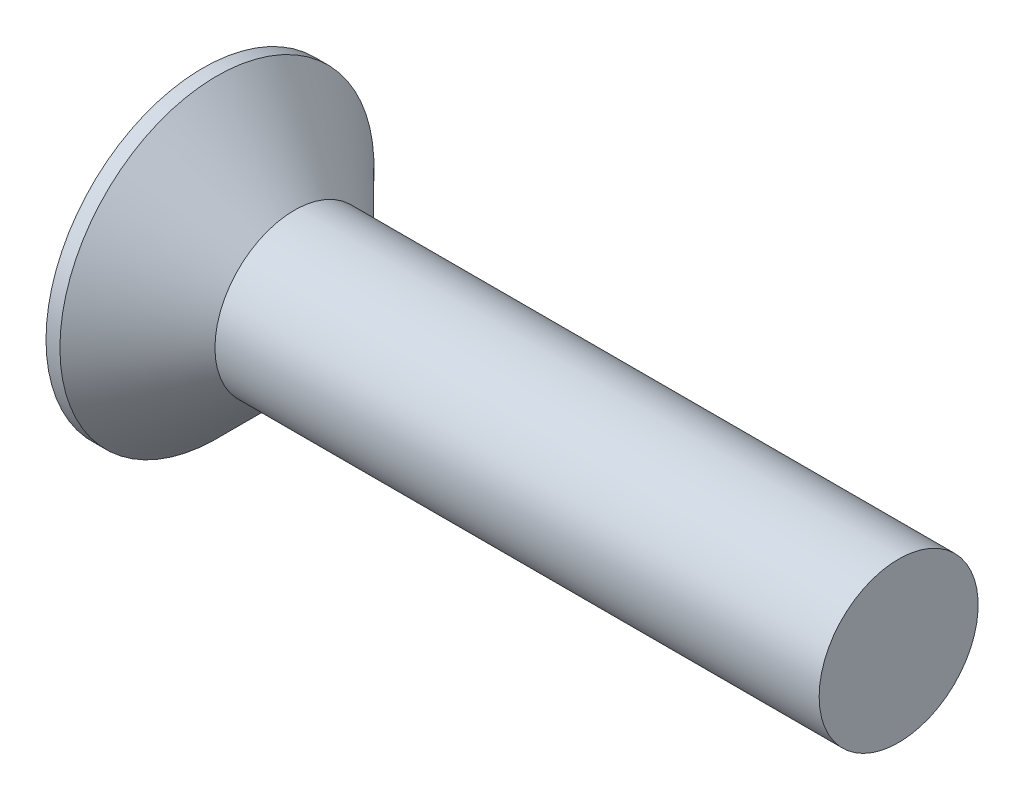
ISO-10303-21;
HEADER;
FILE_DESCRIPTION(('STEP AP214'),'2;1');
FILE_NAME('part.step','',(''),(''),'','','');
FILE_SCHEMA(('AUTOMOTIVE_DESIGN { 1 0 10303 214 1 1 1 1 }'));
ENDSEC;
DATA;
#1=APPLICATION_CONTEXT('core data for automotive mechanical design processes');
#2=APPLICATION_PROTOCOL_DEFINITION('international standard','automotive_design',2000,#1);
#3=PRODUCT_CONTEXT('',#1,'mechanical');
#4=PRODUCT('Part','Part','',(#3));
#5=PRODUCT_RELATED_PRODUCT_CATEGORY('part','',(#4));
#6=PRODUCT_DEFINITION_FORMATION('','',#4);
#7=PRODUCT_DEFINITION_CONTEXT('part definition',#1,'design');
#8=PRODUCT_DEFINITION('design','',#6,#7);
#9=PRODUCT_DEFINITION_SHAPE('','',#8);
#10=(LENGTH_UNIT() NAMED_UNIT(*) SI_UNIT(.MILLI.,.METRE.));
#11=(NAMED_UNIT(*) PLANE_ANGLE_UNIT() SI_UNIT($,.RADIAN.));
#12=(NAMED_UNIT(*) SI_UNIT($,.STERADIAN.) SOLID_ANGLE_UNIT());
#13=UNCERTAINTY_MEASURE_WITH_UNIT(LENGTH_MEASURE(1.E-05),#10,'distance_accuracy_value','');
#14=(GEOMETRIC_REPRESENTATION_CONTEXT(3) GLOBAL_UNCERTAINTY_ASSIGNED_CONTEXT((#13)) GLOBAL_UNIT_ASSIGNED_CONTEXT((#10,
#11,#12)) REPRESENTATION_CONTEXT('',''));
#15=CARTESIAN_POINT('',(0.,0.,0.));
#16=DIRECTION('',(0.,0.,1.));
#17=DIRECTION('',(1.,0.,0.));
#18=AXIS2_PLACEMENT_3D('',#15,#16,#17);
#19=CARTESIAN_POINT('',(0.,0.,0.));
#20=DIRECTION('',(-1.,0.,0.));
#21=DIRECTION('',(0.,0.,1.));
#22=AXIS2_PLACEMENT_3D('',#19,#20,#21);
#23=PLANE('',#22);
#24=CARTESIAN_POINT('',(0.,0.,0.));
#25=DIRECTION('',(-1.,0.,0.));
#26=DIRECTION('',(0.,0.,1.));
#27=AXIS2_PLACEMENT_3D('',#24,#25,#26);
#28=CIRCLE('',#27,7.9);
#29=CARTESIAN_POINT('',(0.,0.,7.9));
#30=VERTEX_POINT('',#29);
#31=EDGE_CURVE('E46',#30,#30,#28,.T.);
#32=ORIENTED_EDGE('',*,*,#31,.T.);
#33=EDGE_LOOP('',(#32));
#34=FACE_BOUND('',#33,.T.);
#35=DIRECTION('',(0.,1.,0.));
#36=VECTOR('',#35,1.);
#37=CARTESIAN_POINT('',(0.,-4.39,-0.9));
#38=LINE('',#37,#36);
#39=CARTESIAN_POINT('',(0.,-4.39,-0.9));
#40=VERTEX_POINT('',#39);
#41=CARTESIAN_POINT('',(0.,-0.899999999999997,-0.899999999999999));
#42=VERTEX_POINT('',#41);
#43=EDGE_CURVE('E107',#40,#42,#38,.T.);
#44=ORIENTED_EDGE('',*,*,#43,.T.);
#45=DIRECTION('',(0.,0.,-1.));
#46=VECTOR('',#45,1.);
#47=CARTESIAN_POINT('',(0.,-0.900000000000015,4.39));
#48=LINE('',#47,#46);
#49=CARTESIAN_POINT('',(0.,-0.899999999999985,-4.39));
#50=VERTEX_POINT('',#49);
#51=EDGE_CURVE('E87',#42,#50,#48,.T.);
#52=ORIENTED_EDGE('',*,*,#51,.T.);
#53=DIRECTION('',(0.,1.,0.));
#54=VECTOR('',#53,1.);
#55=CARTESIAN_POINT('',(0.,-0.899999999999985,-4.39));
#56=LINE('',#55,#54);
#57=CARTESIAN_POINT('',(0.,0.900000000000015,-4.39));
#58=VERTEX_POINT('',#57);
#59=EDGE_CURVE('E344',#50,#58,#56,.T.);
#60=ORIENTED_EDGE('',*,*,#59,.T.);
#61=DIRECTION('',(0.,0.,1.));
#62=VECTOR('',#61,1.);
#63=CARTESIAN_POINT('',(0.,0.900000000000015,-4.39));
#64=LINE('',#63,#62);
#65=CARTESIAN_POINT('',(0.,0.900000000000002,-0.899999999999999));
#66=VERTEX_POINT('',#65);
#67=EDGE_CURVE('E103',#58,#66,#64,.T.);
#68=ORIENTED_EDGE('',*,*,#67,.T.);
#69=CARTESIAN_POINT('',(0.,4.39,-0.899999999999999));
#70=VERTEX_POINT('',#69);
#71=EDGE_CURVE('E97',#66,#70,#38,.T.);
#72=ORIENTED_EDGE('',*,*,#71,.T.);
#73=DIRECTION('',(0.,0.,1.));
#74=VECTOR('',#73,1.);
#75=CARTESIAN_POINT('',(0.,4.39,-0.899999999999999));
#76=LINE('',#75,#74);
#77=CARTESIAN_POINT('',(0.,4.39,0.899999999999999));
#78=VERTEX_POINT('',#77);
#79=EDGE_CURVE('E100',#70,#78,#76,.T.);
#80=ORIENTED_EDGE('',*,*,#79,.T.);
#81=DIRECTION('',(0.,-1.,0.));
#82=VECTOR('',#81,1.);
#83=CARTESIAN_POINT('',(0.,4.39,0.899999999999999));
#84=LINE('',#83,#82);
#85=CARTESIAN_POINT('',(0.,0.899999999999996,0.899999999999999));
#86=VERTEX_POINT('',#85);
#87=EDGE_CURVE('E356',#78,#86,#84,.T.);
#88=ORIENTED_EDGE('',*,*,#87,.T.);
#89=CARTESIAN_POINT('',(0.,0.899999999999984,4.39));
#90=VERTEX_POINT('',#89);
#91=EDGE_CURVE('E339',#86,#90,#64,.T.);
#92=ORIENTED_EDGE('',*,*,#91,.T.);
#93=DIRECTION('',(0.,-1.,0.));
#94=VECTOR('',#93,1.);
#95=CARTESIAN_POINT('',(0.,0.899999999999984,4.39));
#96=LINE('',#95,#94);
#97=CARTESIAN_POINT('',(0.,-0.900000000000015,4.39));
#98=VERTEX_POINT('',#97);
#99=EDGE_CURVE('E325',#90,#98,#96,.T.);
#100=ORIENTED_EDGE('',*,*,#99,.T.);
#101=CARTESIAN_POINT('',(0.,-0.900000000000003,0.899999999999999));
#102=VERTEX_POINT('',#101);
#103=EDGE_CURVE('E337',#98,#102,#48,.T.);
#104=ORIENTED_EDGE('',*,*,#103,.T.);
#105=CARTESIAN_POINT('',(0.,-4.39,0.9));
#106=VERTEX_POINT('',#105);
#107=EDGE_CURVE('E113',#102,#106,#84,.T.);
#108=ORIENTED_EDGE('',*,*,#107,.T.);
#109=DIRECTION('',(0.,0.,-1.));
#110=VECTOR('',#109,1.);
#111=CARTESIAN_POINT('',(0.,-4.39,0.9));
#112=LINE('',#111,#110);
#113=EDGE_CURVE('E136',#106,#40,#112,.T.);
#114=ORIENTED_EDGE('',*,*,#113,.T.);
#115=EDGE_LOOP('',(#44,#52,#60,#68,#72,#80,#88,#92,#100,#104,#108,#114));
#116=FACE_BOUND('',#115,.T.);
#117=ADVANCED_FACE('F39',(#34,#116),#23,.T.);
#118=CARTESIAN_POINT('',(5.43736040609137,0.,0.398604060913706));
#119=DIRECTION('',(-0.0918235415051405,0.,-0.995775294544635));
#120=DIRECTION('',(-0.995775294544635,0.,0.0918235415051405));
#121=AXIS2_PLACEMENT_3D('',#118,#119,#120);
#122=PLANE('',#121);
#123=ORIENTED_EDGE('',*,*,#107,.F.);
#124=DIRECTION('',(0.991603685025061,0.091438864397803,-0.0914388643978027));
#125=VECTOR('',#124,1.);
#126=CARTESIAN_POINT('',(5.47350228069464,-0.395271306083487,0.395271306083486));
#127=LINE('',#126,#125);
#128=CARTESIAN_POINT('',(4.88,-0.450000000000002,0.449999999999998));
#129=VERTEX_POINT('',#128);
#130=EDGE_CURVE('E131',#102,#129,#127,.T.);
#131=ORIENTED_EDGE('',*,*,#130,.T.);
#132=DIRECTION('',(0.776066154586016,0.626578001858382,-0.0715634773696122));
#133=VECTOR('',#132,1.);
#134=CARTESIAN_POINT('',(0.,-4.39,0.9));
#135=LINE('',#134,#133);
#136=EDGE_CURVE('E108',#106,#129,#135,.T.);
#137=ORIENTED_EDGE('',*,*,#136,.F.);
#138=EDGE_LOOP('',(#123,#131,#137));
#139=FACE_BOUND('',#138,.T.);
#140=ADVANCED_FACE('F159',(#139),#122,.T.);
#141=DIRECTION('',(0.776066154586016,-0.626578001858382,-0.0715634773696121));
#142=VECTOR('',#141,1.);
#143=CARTESIAN_POINT('',(0.,4.39,0.899999999999999));
#144=LINE('',#143,#142);
#145=CARTESIAN_POINT('',(4.88,0.45,0.45));
#146=VERTEX_POINT('',#145);
#147=EDGE_CURVE('E53',#78,#146,#144,.T.);
#148=ORIENTED_EDGE('',*,*,#147,.T.);
#149=DIRECTION('',(-0.991603685025061,0.0914388643978024,0.0914388643978027));
#150=VECTOR('',#149,1.);
#151=CARTESIAN_POINT('',(5.47350228069464,0.395271306083484,0.395271306083486));
#152=LINE('',#151,#150);
#153=EDGE_CURVE('E352',#146,#86,#152,.T.);
#154=ORIENTED_EDGE('',*,*,#153,.T.);
#155=ORIENTED_EDGE('',*,*,#87,.F.);
#156=EDGE_LOOP('',(#148,#154,#155));
#157=FACE_BOUND('',#156,.T.);
#158=ADVANCED_FACE('F163',(#157),#122,.T.);
#159=CARTESIAN_POINT('',(5.43736040609137,0.,-0.398604060913706));
#160=DIRECTION('',(-0.0918235415051404,0.,0.995775294544635));
#161=DIRECTION('',(0.995775294544635,0.,0.0918235415051404));
#162=AXIS2_PLACEMENT_3D('',#159,#160,#161);
#163=PLANE('',#162);
#164=DIRECTION('',(0.776066154586016,0.626578001858382,0.0715634773696121));
#165=VECTOR('',#164,1.);
#166=CARTESIAN_POINT('',(0.,-4.39,-0.9));
#167=LINE('',#166,#165);
#168=CARTESIAN_POINT('',(4.88,-0.449999999999999,-0.450000000000002));
#169=VERTEX_POINT('',#168);
#170=EDGE_CURVE('E62',#40,#169,#167,.T.);
#171=ORIENTED_EDGE('',*,*,#170,.T.);
#172=DIRECTION('',(-0.991603685025061,-0.0914388643978024,-0.0914388643978027));
#173=VECTOR('',#172,1.);
#174=CARTESIAN_POINT('',(5.47350228069464,-0.395271306083484,-0.395271306083486));
#175=LINE('',#174,#173);
#176=EDGE_CURVE('E11',#169,#42,#175,.T.);
#177=ORIENTED_EDGE('',*,*,#176,.T.);
#178=ORIENTED_EDGE('',*,*,#43,.F.);
#179=EDGE_LOOP('',(#171,#177,#178));
#180=FACE_BOUND('',#179,.T.);
#181=ADVANCED_FACE('F156',(#180),#163,.T.);
#182=ORIENTED_EDGE('',*,*,#71,.F.);
#183=DIRECTION('',(0.991603685025061,-0.091438864397803,0.0914388643978027));
#184=VECTOR('',#183,1.);
#185=CARTESIAN_POINT('',(5.47350228069464,0.395271306083487,-0.395271306083486));
#186=LINE('',#185,#184);
#187=CARTESIAN_POINT('',(4.88,0.45,-0.45));
#188=VERTEX_POINT('',#187);
#189=EDGE_CURVE('E116',#66,#188,#186,.T.);
#190=ORIENTED_EDGE('',*,*,#189,.T.);
#191=DIRECTION('',(0.776066154586016,-0.626578001858382,0.0715634773696121));
#192=VECTOR('',#191,1.);
#193=CARTESIAN_POINT('',(0.,4.39,-0.899999999999999));
#194=LINE('',#193,#192);
#195=EDGE_CURVE('E112',#70,#188,#194,.T.);
#196=ORIENTED_EDGE('',*,*,#195,.F.);
#197=EDGE_LOOP('',(#182,#190,#196));
#198=FACE_BOUND('',#197,.T.);
#199=ADVANCED_FACE('F115',(#198),#163,.T.);
#200=CARTESIAN_POINT('',(-6.34999999999999,0.,0.));
#201=DIRECTION('',(-1.,0.,0.));
#202=DIRECTION('',(0.,0.,1.));
#203=AXIS2_PLACEMENT_3D('',#200,#201,#202);
#204=CYLINDRICAL_SURFACE('',#203,7.9);
#205=CARTESIAN_POINT('',(0.700000000000013,0.,0.));
#206=DIRECTION('',(-1.,0.,0.));
#207=DIRECTION('',(0.,0.,1.));
#208=AXIS2_PLACEMENT_3D('',#205,#206,#207);
#209=CIRCLE('',#208,7.9);
#210=CARTESIAN_POINT('',(0.700000000000013,0.,7.9));
#211=VERTEX_POINT('',#210);
#212=EDGE_CURVE('E139',#211,#211,#209,.T.);
#213=ORIENTED_EDGE('',*,*,#212,.T.);
#214=EDGE_LOOP('',(#213));
#215=FACE_BOUND('',#214,.T.);
#216=ORIENTED_EDGE('',*,*,#31,.F.);
#217=EDGE_LOOP('',(#216));
#218=FACE_BOUND('',#217,.T.);
#219=ADVANCED_FACE('F145',(#215,#218),#204,.T.);
#220=CARTESIAN_POINT('',(0.700000000000013,0.,0.));
#221=DIRECTION('',(-1.,0.,0.));
#222=DIRECTION('',(0.,0.,1.));
#223=AXIS2_PLACEMENT_3D('',#220,#221,#222);
#224=CONICAL_SURFACE('',#223,7.9,0.78539816339745);
#225=CARTESIAN_POINT('',(4.6,0.,0.));
#226=DIRECTION('',(-1.,0.,0.));
#227=DIRECTION('',(0.,0.,1.));
#228=AXIS2_PLACEMENT_3D('',#225,#226,#227);
#229=CIRCLE('',#228,4.);
#230=CARTESIAN_POINT('',(4.6,0.,4.));
#231=VERTEX_POINT('',#230);
#232=EDGE_CURVE('E135',#231,#231,#229,.T.);
#233=ORIENTED_EDGE('',*,*,#232,.T.);
#234=EDGE_LOOP('',(#233));
#235=FACE_BOUND('',#234,.T.);
#236=ORIENTED_EDGE('',*,*,#212,.F.);
#237=EDGE_LOOP('',(#236));
#238=FACE_BOUND('',#237,.T.);
#239=ADVANCED_FACE('F147',(#235,#238),#224,.T.);
#240=CARTESIAN_POINT('',(-6.34999999999999,0.,0.));
#241=DIRECTION('',(-1.,0.,0.));
#242=DIRECTION('',(0.,0.,1.));
#243=AXIS2_PLACEMENT_3D('',#240,#241,#242);
#244=CYLINDRICAL_SURFACE('',#243,4.);
#245=CARTESIAN_POINT('',(35.,0.,0.));
#246=DIRECTION('',(-1.,0.,0.));
#247=DIRECTION('',(0.,0.,1.));
#248=AXIS2_PLACEMENT_3D('',#245,#246,#247);
#249=CIRCLE('',#248,4.);
#250=CARTESIAN_POINT('',(35.,0.,4.));
#251=VERTEX_POINT('',#250);
#252=EDGE_CURVE('E132',#251,#251,#249,.T.);
#253=ORIENTED_EDGE('',*,*,#252,.T.);
#254=EDGE_LOOP('',(#253));
#255=FACE_BOUND('',#254,.T.);
#256=ORIENTED_EDGE('',*,*,#232,.F.);
#257=EDGE_LOOP('',(#256));
#258=FACE_BOUND('',#257,.T.);
#259=ADVANCED_FACE('F153',(#255,#258),#244,.T.);
#260=CARTESIAN_POINT('',(35.,4.,0.));
#261=DIRECTION('',(1.,0.,0.));
#262=DIRECTION('',(0.,0.,-1.));
#263=AXIS2_PLACEMENT_3D('',#260,#261,#262);
#264=PLANE('',#263);
#265=ORIENTED_EDGE('',*,*,#252,.F.);
#266=EDGE_LOOP('',(#265));
#267=FACE_BOUND('',#266,.T.);
#268=ADVANCED_FACE('F183',(#267),#264,.T.);
#269=CARTESIAN_POINT('',(4.88,0.45,-0.45));
#270=DIRECTION('',(1.,0.,0.));
#271=DIRECTION('',(0.,0.,-1.));
#272=AXIS2_PLACEMENT_3D('',#269,#270,#271);
#273=PLANE('',#272);
#274=DIRECTION('',(0.,1.,0.));
#275=VECTOR('',#274,1.);
#276=CARTESIAN_POINT('',(4.88,-0.45,-0.45));
#277=LINE('',#276,#275);
#278=EDGE_CURVE('E127',#169,#188,#277,.T.);
#279=ORIENTED_EDGE('',*,*,#278,.F.);
#280=DIRECTION('',(0.,0.,-1.));
#281=VECTOR('',#280,1.);
#282=CARTESIAN_POINT('',(4.88,-0.45,0.45));
#283=LINE('',#282,#281);
#284=EDGE_CURVE('E118',#129,#169,#283,.T.);
#285=ORIENTED_EDGE('',*,*,#284,.F.);
#286=DIRECTION('',(0.,-1.,0.));
#287=VECTOR('',#286,1.);
#288=CARTESIAN_POINT('',(4.88,0.45,0.45));
#289=LINE('',#288,#287);
#290=EDGE_CURVE('E121',#146,#129,#289,.T.);
#291=ORIENTED_EDGE('',*,*,#290,.F.);
#292=DIRECTION('',(0.,0.,1.));
#293=VECTOR('',#292,1.);
#294=CARTESIAN_POINT('',(4.88,0.45,-0.45));
#295=LINE('',#294,#293);
#296=EDGE_CURVE('E125',#188,#146,#295,.T.);
#297=ORIENTED_EDGE('',*,*,#296,.F.);
#298=EDGE_LOOP('',(#279,#285,#291,#297));
#299=FACE_BOUND('',#298,.T.);
#300=ADVANCED_FACE('F180',(#299),#273,.F.);
#301=CARTESIAN_POINT('',(0.,-4.39,-0.9));
#302=DIRECTION('',(-0.628188647758139,0.778061066258812,0.));
#303=DIRECTION('',(-0.778061066258813,-0.62818864775814,0.));
#304=AXIS2_PLACEMENT_3D('',#301,#302,#303);
#305=PLANE('',#304);
#306=ORIENTED_EDGE('',*,*,#170,.F.);
#307=ORIENTED_EDGE('',*,*,#113,.F.);
#308=ORIENTED_EDGE('',*,*,#136,.T.);
#309=ORIENTED_EDGE('',*,*,#284,.T.);
#310=EDGE_LOOP('',(#306,#307,#308,#309));
#311=FACE_BOUND('',#310,.T.);
#312=ADVANCED_FACE('F172',(#311),#305,.T.);
#313=CARTESIAN_POINT('',(0.,4.39,0.899999999999999));
#314=DIRECTION('',(-0.628188647758139,-0.778061066258812,0.));
#315=DIRECTION('',(0.778061066258813,-0.62818864775814,0.));
#316=AXIS2_PLACEMENT_3D('',#313,#314,#315);
#317=PLANE('',#316);
#318=ORIENTED_EDGE('',*,*,#147,.F.);
#319=ORIENTED_EDGE('',*,*,#79,.F.);
#320=ORIENTED_EDGE('',*,*,#195,.T.);
#321=ORIENTED_EDGE('',*,*,#296,.T.);
#322=EDGE_LOOP('',(#318,#319,#320,#321));
#323=FACE_BOUND('',#322,.T.);
#324=ADVANCED_FACE('F111',(#323),#317,.T.);
#325=CARTESIAN_POINT('',(5.43736040609137,-0.398604060913706,0.));
#326=DIRECTION('',(-0.0918235415051405,0.995775294544635,0.));
#327=DIRECTION('',(-0.995775294544635,-0.0918235415051405,0.));
#328=AXIS2_PLACEMENT_3D('',#325,#326,#327);
#329=PLANE('',#328);
#330=DIRECTION('',(0.776066154586016,0.07156347736961,0.626578001858382));
#331=VECTOR('',#330,1.);
#332=CARTESIAN_POINT('',(0.,-0.899999999999985,-4.39));
#333=LINE('',#332,#331);
#334=EDGE_CURVE('E346',#50,#169,#333,.T.);
#335=ORIENTED_EDGE('',*,*,#334,.F.);
#336=ORIENTED_EDGE('',*,*,#51,.F.);
#337=ORIENTED_EDGE('',*,*,#176,.F.);
#338=EDGE_LOOP('',(#335,#336,#337));
#339=FACE_BOUND('',#338,.T.);
#340=ADVANCED_FACE('F179',(#339),#329,.T.);
#341=CARTESIAN_POINT('',(5.43736040609137,0.398604060913706,0.));
#342=DIRECTION('',(-0.0918235415051404,-0.995775294544635,0.));
#343=DIRECTION('',(0.995775294544635,-0.0918235415051404,0.));
#344=AXIS2_PLACEMENT_3D('',#341,#342,#343);
#345=PLANE('',#344);
#346=ORIENTED_EDGE('',*,*,#67,.F.);
#347=DIRECTION('',(0.776066154586016,-0.0715634773696143,0.626578001858382));
#348=VECTOR('',#347,1.);
#349=CARTESIAN_POINT('',(0.,0.900000000000015,-4.39));
#350=LINE('',#349,#348);
#351=EDGE_CURVE('E78',#58,#188,#350,.T.);
#352=ORIENTED_EDGE('',*,*,#351,.T.);
#353=ORIENTED_EDGE('',*,*,#189,.F.);
#354=EDGE_LOOP('',(#346,#352,#353));
#355=FACE_BOUND('',#354,.T.);
#356=ADVANCED_FACE('F223',(#355),#345,.T.);
#357=CARTESIAN_POINT('',(0.,0.900000000000015,-4.39));
#358=DIRECTION('',(-0.628188647758139,0.,0.778061066258812));
#359=DIRECTION('',(-0.778061066258813,0.,-0.62818864775814));
#360=AXIS2_PLACEMENT_3D('',#357,#358,#359);
#361=PLANE('',#360);
#362=ORIENTED_EDGE('',*,*,#351,.F.);
#363=ORIENTED_EDGE('',*,*,#59,.F.);
#364=ORIENTED_EDGE('',*,*,#334,.T.);
#365=ORIENTED_EDGE('',*,*,#278,.T.);
#366=EDGE_LOOP('',(#362,#363,#364,#365));
#367=FACE_BOUND('',#366,.T.);
#368=ADVANCED_FACE('F231',(#367),#361,.T.);
#369=ORIENTED_EDGE('',*,*,#103,.F.);
#370=DIRECTION('',(0.776066154586016,0.0715634773696143,-0.626578001858382));
#371=VECTOR('',#370,1.);
#372=CARTESIAN_POINT('',(0.,-0.900000000000015,4.39));
#373=LINE('',#372,#371);
#374=EDGE_CURVE('E322',#98,#129,#373,.T.);
#375=ORIENTED_EDGE('',*,*,#374,.T.);
#376=ORIENTED_EDGE('',*,*,#130,.F.);
#377=EDGE_LOOP('',(#369,#375,#376));
#378=FACE_BOUND('',#377,.T.);
#379=ADVANCED_FACE('F225',(#378),#329,.T.);
#380=DIRECTION('',(0.776066154586016,-0.0715634773696099,-0.626578001858382));
#381=VECTOR('',#380,1.);
#382=CARTESIAN_POINT('',(0.,0.899999999999984,4.39));
#383=LINE('',#382,#381);
#384=EDGE_CURVE('E333',#90,#146,#383,.T.);
#385=ORIENTED_EDGE('',*,*,#384,.F.);
#386=ORIENTED_EDGE('',*,*,#91,.F.);
#387=ORIENTED_EDGE('',*,*,#153,.F.);
#388=EDGE_LOOP('',(#385,#386,#387));
#389=FACE_BOUND('',#388,.T.);
#390=ADVANCED_FACE('F233',(#389),#345,.T.);
#391=CARTESIAN_POINT('',(0.,-0.900000000000014,4.39));
#392=DIRECTION('',(-0.628188647758139,0.,-0.778061066258812));
#393=DIRECTION('',(0.778061066258813,0.,-0.62818864775814));
#394=AXIS2_PLACEMENT_3D('',#391,#392,#393);
#395=PLANE('',#394);
#396=ORIENTED_EDGE('',*,*,#374,.F.);
#397=ORIENTED_EDGE('',*,*,#99,.F.);
#398=ORIENTED_EDGE('',*,*,#384,.T.);
#399=ORIENTED_EDGE('',*,*,#290,.T.);
#400=EDGE_LOOP('',(#396,#397,#398,#399));
#401=FACE_BOUND('',#400,.T.);
#402=ADVANCED_FACE('F252',(#401),#395,.T.);
#403=CLOSED_SHELL('',(#117,#140,#158,#181,#199,#219,#239,#259,#268,#300,#312,#324,#340,#356,
#368,#379,#390,#402));
#404=MANIFOLD_SOLID_BREP('B2',#403);
#405=ADVANCED_BREP_SHAPE_REPRESENTATION('',(#18,#404),#14);
#406=SHAPE_DEFINITION_REPRESENTATION(#9,#405);
ENDSEC;
END-ISO-10303-21;
